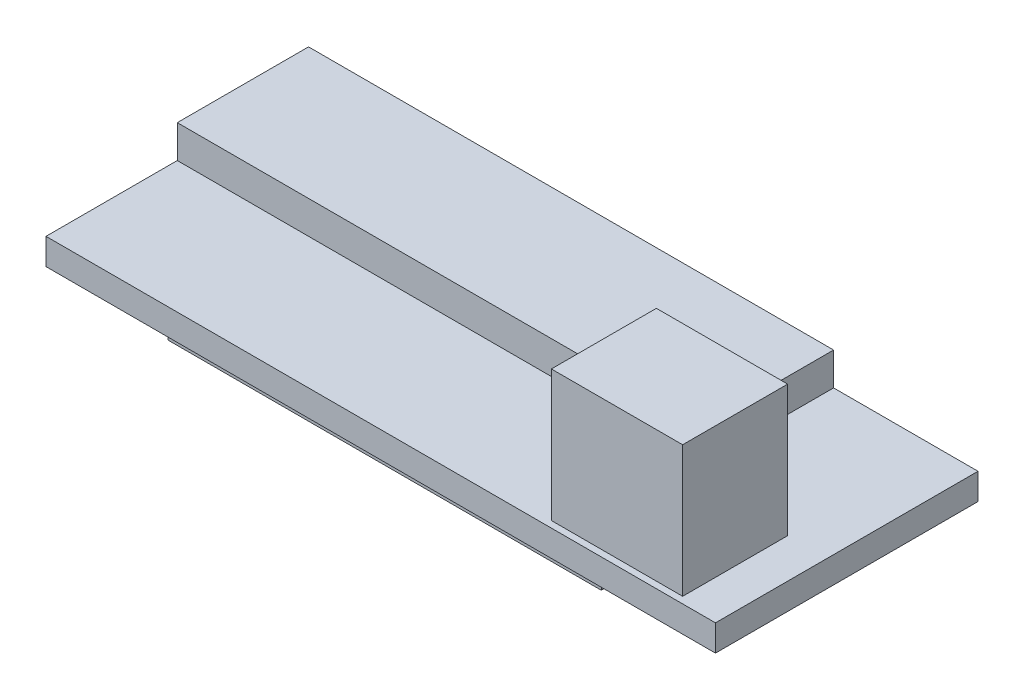
ISO-10303-21;
HEADER;
FILE_DESCRIPTION(('STEP AP214'),'2;1');
FILE_NAME('part.step','',(''),(''),'','','');
FILE_SCHEMA(('AUTOMOTIVE_DESIGN { 1 0 10303 214 1 1 1 1 }'));
ENDSEC;
DATA;
#1=APPLICATION_CONTEXT('core data for automotive mechanical design processes');
#2=APPLICATION_PROTOCOL_DEFINITION('international standard','automotive_design',2000,#1);
#3=PRODUCT_CONTEXT('',#1,'mechanical');
#4=PRODUCT('Part','Part','',(#3));
#5=PRODUCT_RELATED_PRODUCT_CATEGORY('part','',(#4));
#6=PRODUCT_DEFINITION_FORMATION('','',#4);
#7=PRODUCT_DEFINITION_CONTEXT('part definition',#1,'design');
#8=PRODUCT_DEFINITION('design','',#6,#7);
#9=PRODUCT_DEFINITION_SHAPE('','',#8);
#10=(LENGTH_UNIT() NAMED_UNIT(*) SI_UNIT(.MILLI.,.METRE.));
#11=(NAMED_UNIT(*) PLANE_ANGLE_UNIT() SI_UNIT($,.RADIAN.));
#12=(NAMED_UNIT(*) SI_UNIT($,.STERADIAN.) SOLID_ANGLE_UNIT());
#13=UNCERTAINTY_MEASURE_WITH_UNIT(LENGTH_MEASURE(1.E-05),#10,'distance_accuracy_value','');
#14=(GEOMETRIC_REPRESENTATION_CONTEXT(3) GLOBAL_UNCERTAINTY_ASSIGNED_CONTEXT((#13)) GLOBAL_UNIT_ASSIGNED_CONTEXT((#10,
#11,#12)) REPRESENTATION_CONTEXT('',''));
#15=CARTESIAN_POINT('',(0.,0.,0.));
#16=DIRECTION('',(0.,0.,1.));
#17=DIRECTION('',(1.,0.,0.));
#18=AXIS2_PLACEMENT_3D('',#15,#16,#17);
#19=CARTESIAN_POINT('',(0.,-8.5,0.));
#20=DIRECTION('',(0.,-1.,0.));
#21=DIRECTION('',(0.,0.,-1.));
#22=AXIS2_PLACEMENT_3D('',#19,#20,#21);
#23=PLANE('',#22);
#24=DIRECTION('',(0.,0.,1.));
#25=VECTOR('',#24,1.);
#26=CARTESIAN_POINT('',(8.5,-8.5,1.7));
#27=LINE('',#26,#25);
#28=CARTESIAN_POINT('',(8.5,-8.5,-3.4));
#29=VERTEX_POINT('',#28);
#30=CARTESIAN_POINT('',(8.5,-8.5,1.7));
#31=VERTEX_POINT('',#30);
#32=EDGE_CURVE('E196',#29,#31,#27,.T.);
#33=ORIENTED_EDGE('',*,*,#32,.T.);
#34=DIRECTION('',(-1.,0.,0.));
#35=VECTOR('',#34,1.);
#36=CARTESIAN_POINT('',(-24.5,-8.5,1.7));
#37=LINE('',#36,#35);
#38=CARTESIAN_POINT('',(-24.5,-8.5,1.7));
#39=VERTEX_POINT('',#38);
#40=EDGE_CURVE('E127',#31,#39,#37,.T.);
#41=ORIENTED_EDGE('',*,*,#40,.T.);
#42=DIRECTION('',(0.,0.,-1.));
#43=VECTOR('',#42,1.);
#44=CARTESIAN_POINT('',(-24.5,-8.5,1.7));
#45=LINE('',#44,#43);
#46=CARTESIAN_POINT('',(-24.5,-8.5,-3.4));
#47=VERTEX_POINT('',#46);
#48=EDGE_CURVE('E28',#39,#47,#45,.T.);
#49=ORIENTED_EDGE('',*,*,#48,.T.);
#50=DIRECTION('',(1.,0.,0.));
#51=VECTOR('',#50,1.);
#52=CARTESIAN_POINT('',(-24.5,-8.5,-3.4));
#53=LINE('',#52,#51);
#54=EDGE_CURVE('E11',#47,#29,#53,.T.);
#55=ORIENTED_EDGE('',*,*,#54,.T.);
#56=EDGE_LOOP('',(#33,#41,#49,#55));
#57=FACE_BOUND('',#56,.T.);
#58=ADVANCED_FACE('F17',(#57),#23,.T.);
#59=CARTESIAN_POINT('',(-24.5,-8.5,-3.4));
#60=DIRECTION('',(0.,0.,1.));
#61=DIRECTION('',(1.,0.,0.));
#62=AXIS2_PLACEMENT_3D('',#59,#60,#61);
#63=PLANE('',#62);
#64=DIRECTION('',(1.,0.,0.));
#65=VECTOR('',#64,1.);
#66=CARTESIAN_POINT('',(-24.5,0.,-3.4));
#67=LINE('',#66,#65);
#68=CARTESIAN_POINT('',(-24.5,0.,-3.4));
#69=VERTEX_POINT('',#68);
#70=CARTESIAN_POINT('',(8.5,0.,-3.4));
#71=VERTEX_POINT('',#70);
#72=EDGE_CURVE('E144',#69,#71,#67,.T.);
#73=ORIENTED_EDGE('',*,*,#72,.T.);
#74=DIRECTION('',(0.,1.,0.));
#75=VECTOR('',#74,1.);
#76=CARTESIAN_POINT('',(8.5,-8.5,-3.4));
#77=LINE('',#76,#75);
#78=EDGE_CURVE('E128',#29,#71,#77,.T.);
#79=ORIENTED_EDGE('',*,*,#78,.F.);
#80=ORIENTED_EDGE('',*,*,#54,.F.);
#81=DIRECTION('',(0.,1.,0.));
#82=VECTOR('',#81,1.);
#83=CARTESIAN_POINT('',(-24.5,-8.5,-3.4));
#84=LINE('',#83,#82);
#85=EDGE_CURVE('E271',#47,#69,#84,.T.);
#86=ORIENTED_EDGE('',*,*,#85,.T.);
#87=EDGE_LOOP('',(#73,#79,#80,#86));
#88=FACE_BOUND('',#87,.T.);
#89=ADVANCED_FACE('F352',(#88),#63,.F.);
#90=CARTESIAN_POINT('',(-24.5,-8.5,1.7));
#91=DIRECTION('',(1.,0.,0.));
#92=DIRECTION('',(0.,1.,0.));
#93=AXIS2_PLACEMENT_3D('',#90,#91,#92);
#94=PLANE('',#93);
#95=DIRECTION('',(0.,0.,-1.));
#96=VECTOR('',#95,1.);
#97=CARTESIAN_POINT('',(-24.5,0.,1.7));
#98=LINE('',#97,#96);
#99=CARTESIAN_POINT('',(-24.5,0.,1.7));
#100=VERTEX_POINT('',#99);
#101=EDGE_CURVE('E121',#100,#69,#98,.T.);
#102=ORIENTED_EDGE('',*,*,#101,.T.);
#103=ORIENTED_EDGE('',*,*,#85,.F.);
#104=ORIENTED_EDGE('',*,*,#48,.F.);
#105=DIRECTION('',(0.,1.,0.));
#106=VECTOR('',#105,1.);
#107=CARTESIAN_POINT('',(-24.5,-8.5,1.7));
#108=LINE('',#107,#106);
#109=EDGE_CURVE('E117',#39,#100,#108,.T.);
#110=ORIENTED_EDGE('',*,*,#109,.T.);
#111=EDGE_LOOP('',(#102,#103,#104,#110));
#112=FACE_BOUND('',#111,.T.);
#113=ADVANCED_FACE('F19',(#112),#94,.F.);
#114=CARTESIAN_POINT('',(-24.5,-8.5,1.7));
#115=DIRECTION('',(0.,0.,-1.));
#116=DIRECTION('',(0.,-1.,0.));
#117=AXIS2_PLACEMENT_3D('',#114,#115,#116);
#118=PLANE('',#117);
#119=DIRECTION('',(-1.,0.,0.));
#120=VECTOR('',#119,1.);
#121=CARTESIAN_POINT('',(-24.5,0.,1.7));
#122=LINE('',#121,#120);
#123=CARTESIAN_POINT('',(8.5,0.,1.7));
#124=VERTEX_POINT('',#123);
#125=EDGE_CURVE('E131',#124,#100,#122,.T.);
#126=ORIENTED_EDGE('',*,*,#125,.T.);
#127=ORIENTED_EDGE('',*,*,#109,.F.);
#128=ORIENTED_EDGE('',*,*,#40,.F.);
#129=DIRECTION('',(0.,1.,0.));
#130=VECTOR('',#129,1.);
#131=CARTESIAN_POINT('',(8.5,-8.5,1.7));
#132=LINE('',#131,#130);
#133=EDGE_CURVE('E134',#31,#124,#132,.T.);
#134=ORIENTED_EDGE('',*,*,#133,.T.);
#135=EDGE_LOOP('',(#126,#127,#128,#134));
#136=FACE_BOUND('',#135,.T.);
#137=ADVANCED_FACE('F132',(#136),#118,.F.);
#138=CARTESIAN_POINT('',(8.5,-8.5,1.7));
#139=DIRECTION('',(-1.,0.,0.));
#140=DIRECTION('',(0.,0.,1.));
#141=AXIS2_PLACEMENT_3D('',#138,#139,#140);
#142=PLANE('',#141);
#143=DIRECTION('',(0.,0.,1.));
#144=VECTOR('',#143,1.);
#145=CARTESIAN_POINT('',(8.5,0.,1.7));
#146=LINE('',#145,#144);
#147=EDGE_CURVE('E152',#71,#124,#146,.T.);
#148=ORIENTED_EDGE('',*,*,#147,.T.);
#149=ORIENTED_EDGE('',*,*,#133,.F.);
#150=ORIENTED_EDGE('',*,*,#32,.F.);
#151=ORIENTED_EDGE('',*,*,#78,.T.);
#152=EDGE_LOOP('',(#148,#149,#150,#151));
#153=FACE_BOUND('',#152,.T.);
#154=ADVANCED_FACE('F371',(#153),#142,.F.);
#155=CARTESIAN_POINT('',(0.,4.5,0.));
#156=DIRECTION('',(0.,1.,0.));
#157=DIRECTION('',(1.,0.,0.));
#158=AXIS2_PLACEMENT_3D('',#155,#156,#157);
#159=PLANE('',#158);
#160=DIRECTION('',(0.,0.,-1.));
#161=VECTOR('',#160,1.);
#162=CARTESIAN_POINT('',(14.5,4.5,-10.));
#163=LINE('',#162,#161);
#164=CARTESIAN_POINT('',(14.5,4.5,0.));
#165=VERTEX_POINT('',#164);
#166=CARTESIAN_POINT('',(14.5,4.5,-10.));
#167=VERTEX_POINT('',#166);
#168=EDGE_CURVE('E156',#165,#167,#163,.T.);
#169=ORIENTED_EDGE('',*,*,#168,.T.);
#170=DIRECTION('',(-1.,0.,0.));
#171=VECTOR('',#170,1.);
#172=CARTESIAN_POINT('',(-25.5,4.5,-10.));
#173=LINE('',#172,#171);
#174=CARTESIAN_POINT('',(-25.5,4.5,-10.));
#175=VERTEX_POINT('',#174);
#176=EDGE_CURVE('E158',#167,#175,#173,.T.);
#177=ORIENTED_EDGE('',*,*,#176,.T.);
#178=DIRECTION('',(0.,0.,1.));
#179=VECTOR('',#178,1.);
#180=CARTESIAN_POINT('',(-25.5,4.5,-10.));
#181=LINE('',#180,#179);
#182=CARTESIAN_POINT('',(-25.5,4.5,0.));
#183=VERTEX_POINT('',#182);
#184=EDGE_CURVE('E166',#175,#183,#181,.T.);
#185=ORIENTED_EDGE('',*,*,#184,.T.);
#186=DIRECTION('',(1.,0.,0.));
#187=VECTOR('',#186,1.);
#188=CARTESIAN_POINT('',(-25.5,4.5,0.));
#189=LINE('',#188,#187);
#190=EDGE_CURVE('E21',#183,#165,#189,.T.);
#191=ORIENTED_EDGE('',*,*,#190,.T.);
#192=EDGE_LOOP('',(#169,#177,#185,#191));
#193=FACE_BOUND('',#192,.T.);
#194=ADVANCED_FACE('F369',(#193),#159,.T.);
#195=CARTESIAN_POINT('',(-25.5,4.5,0.));
#196=DIRECTION('',(0.,0.,-1.));
#197=DIRECTION('',(0.,-1.,0.));
#198=AXIS2_PLACEMENT_3D('',#195,#196,#197);
#199=PLANE('',#198);
#200=DIRECTION('',(1.,0.,0.));
#201=VECTOR('',#200,1.);
#202=CARTESIAN_POINT('',(-25.5,2.,0.));
#203=LINE('',#202,#201);
#204=CARTESIAN_POINT('',(-25.5,2.,0.));
#205=VERTEX_POINT('',#204);
#206=CARTESIAN_POINT('',(14.5,2.,0.));
#207=VERTEX_POINT('',#206);
#208=EDGE_CURVE('E200',#205,#207,#203,.T.);
#209=ORIENTED_EDGE('',*,*,#208,.T.);
#210=DIRECTION('',(0.,-1.,0.));
#211=VECTOR('',#210,1.);
#212=CARTESIAN_POINT('',(14.5,4.5,0.));
#213=LINE('',#212,#211);
#214=EDGE_CURVE('E258',#165,#207,#213,.T.);
#215=ORIENTED_EDGE('',*,*,#214,.F.);
#216=ORIENTED_EDGE('',*,*,#190,.F.);
#217=DIRECTION('',(0.,-1.,0.));
#218=VECTOR('',#217,1.);
#219=CARTESIAN_POINT('',(-25.5,4.5,0.));
#220=LINE('',#219,#218);
#221=EDGE_CURVE('E163',#183,#205,#220,.T.);
#222=ORIENTED_EDGE('',*,*,#221,.T.);
#223=EDGE_LOOP('',(#209,#215,#216,#222));
#224=FACE_BOUND('',#223,.T.);
#225=ADVANCED_FACE('F360',(#224),#199,.F.);
#226=CARTESIAN_POINT('',(14.5,4.5,-10.));
#227=DIRECTION('',(-1.,0.,0.));
#228=DIRECTION('',(0.,1.,0.));
#229=AXIS2_PLACEMENT_3D('',#226,#227,#228);
#230=PLANE('',#229);
#231=DIRECTION('',(0.,0.,-1.));
#232=VECTOR('',#231,1.);
#233=CARTESIAN_POINT('',(14.5,2.,-10.));
#234=LINE('',#233,#232);
#235=CARTESIAN_POINT('',(14.5,2.,-10.));
#236=VERTEX_POINT('',#235);
#237=EDGE_CURVE('E192',#207,#236,#234,.T.);
#238=ORIENTED_EDGE('',*,*,#237,.T.);
#239=DIRECTION('',(0.,-1.,0.));
#240=VECTOR('',#239,1.);
#241=CARTESIAN_POINT('',(14.5,4.5,-10.));
#242=LINE('',#241,#240);
#243=EDGE_CURVE('E161',#167,#236,#242,.T.);
#244=ORIENTED_EDGE('',*,*,#243,.F.);
#245=ORIENTED_EDGE('',*,*,#168,.F.);
#246=ORIENTED_EDGE('',*,*,#214,.T.);
#247=EDGE_LOOP('',(#238,#244,#245,#246));
#248=FACE_BOUND('',#247,.T.);
#249=ADVANCED_FACE('F300',(#248),#230,.F.);
#250=CARTESIAN_POINT('',(0.,12.,0.));
#251=DIRECTION('',(0.,1.,0.));
#252=DIRECTION('',(1.,0.,0.));
#253=AXIS2_PLACEMENT_3D('',#250,#251,#252);
#254=PLANE('',#253);
#255=DIRECTION('',(0.,0.,-1.));
#256=VECTOR('',#255,1.);
#257=CARTESIAN_POINT('',(22.5,12.,1.5));
#258=LINE('',#257,#256);
#259=CARTESIAN_POINT('',(22.5,12.,9.5));
#260=VERTEX_POINT('',#259);
#261=CARTESIAN_POINT('',(22.5,12.,1.5));
#262=VERTEX_POINT('',#261);
#263=EDGE_CURVE('E189',#260,#262,#258,.T.);
#264=ORIENTED_EDGE('',*,*,#263,.T.);
#265=DIRECTION('',(-1.,0.,0.));
#266=VECTOR('',#265,1.);
#267=CARTESIAN_POINT('',(12.5,12.,1.5));
#268=LINE('',#267,#266);
#269=CARTESIAN_POINT('',(12.5,12.,1.5));
#270=VERTEX_POINT('',#269);
#271=EDGE_CURVE('E244',#262,#270,#268,.T.);
#272=ORIENTED_EDGE('',*,*,#271,.T.);
#273=DIRECTION('',(0.,0.,1.));
#274=VECTOR('',#273,1.);
#275=CARTESIAN_POINT('',(12.5,12.,1.5));
#276=LINE('',#275,#274);
#277=CARTESIAN_POINT('',(12.5,12.,9.5));
#278=VERTEX_POINT('',#277);
#279=EDGE_CURVE('E227',#270,#278,#276,.T.);
#280=ORIENTED_EDGE('',*,*,#279,.T.);
#281=DIRECTION('',(1.,0.,0.));
#282=VECTOR('',#281,1.);
#283=CARTESIAN_POINT('',(12.5,12.,9.5));
#284=LINE('',#283,#282);
#285=EDGE_CURVE('E230',#278,#260,#284,.T.);
#286=ORIENTED_EDGE('',*,*,#285,.T.);
#287=EDGE_LOOP('',(#264,#272,#280,#286));
#288=FACE_BOUND('',#287,.T.);
#289=ADVANCED_FACE('F341',(#288),#254,.T.);
#290=CARTESIAN_POINT('',(12.5,12.,9.5));
#291=DIRECTION('',(0.,0.,-1.));
#292=DIRECTION('',(0.,-1.,0.));
#293=AXIS2_PLACEMENT_3D('',#290,#291,#292);
#294=PLANE('',#293);
#295=DIRECTION('',(1.,0.,0.));
#296=VECTOR('',#295,1.);
#297=CARTESIAN_POINT('',(12.5,2.,9.5));
#298=LINE('',#297,#296);
#299=CARTESIAN_POINT('',(12.5,2.,9.5));
#300=VERTEX_POINT('',#299);
#301=CARTESIAN_POINT('',(22.5,2.,9.5));
#302=VERTEX_POINT('',#301);
#303=EDGE_CURVE('E173',#300,#302,#298,.T.);
#304=ORIENTED_EDGE('',*,*,#303,.T.);
#305=DIRECTION('',(0.,-1.,0.));
#306=VECTOR('',#305,1.);
#307=CARTESIAN_POINT('',(22.5,12.,9.5));
#308=LINE('',#307,#306);
#309=EDGE_CURVE('E207',#260,#302,#308,.T.);
#310=ORIENTED_EDGE('',*,*,#309,.F.);
#311=ORIENTED_EDGE('',*,*,#285,.F.);
#312=DIRECTION('',(0.,-1.,0.));
#313=VECTOR('',#312,1.);
#314=CARTESIAN_POINT('',(12.5,12.,9.5));
#315=LINE('',#314,#313);
#316=EDGE_CURVE('E231',#278,#300,#315,.T.);
#317=ORIENTED_EDGE('',*,*,#316,.T.);
#318=EDGE_LOOP('',(#304,#310,#311,#317));
#319=FACE_BOUND('',#318,.T.);
#320=ADVANCED_FACE('F339',(#319),#294,.F.);
#321=CARTESIAN_POINT('',(12.5,12.,1.5));
#322=DIRECTION('',(1.,0.,0.));
#323=DIRECTION('',(0.,0.,-1.));
#324=AXIS2_PLACEMENT_3D('',#321,#322,#323);
#325=PLANE('',#324);
#326=DIRECTION('',(0.,0.,1.));
#327=VECTOR('',#326,1.);
#328=CARTESIAN_POINT('',(12.5,2.,1.5));
#329=LINE('',#328,#327);
#330=CARTESIAN_POINT('',(12.5,2.,1.5));
#331=VERTEX_POINT('',#330);
#332=EDGE_CURVE('E168',#331,#300,#329,.T.);
#333=ORIENTED_EDGE('',*,*,#332,.T.);
#334=ORIENTED_EDGE('',*,*,#316,.F.);
#335=ORIENTED_EDGE('',*,*,#279,.F.);
#336=DIRECTION('',(0.,-1.,0.));
#337=VECTOR('',#336,1.);
#338=CARTESIAN_POINT('',(12.5,12.,1.5));
#339=LINE('',#338,#337);
#340=EDGE_CURVE('E252',#270,#331,#339,.T.);
#341=ORIENTED_EDGE('',*,*,#340,.T.);
#342=EDGE_LOOP('',(#333,#334,#335,#341));
#343=FACE_BOUND('',#342,.T.);
#344=ADVANCED_FACE('F326',(#343),#325,.F.);
#345=CARTESIAN_POINT('',(12.5,12.,1.5));
#346=DIRECTION('',(0.,0.,1.));
#347=DIRECTION('',(1.,0.,0.));
#348=AXIS2_PLACEMENT_3D('',#345,#346,#347);
#349=PLANE('',#348);
#350=DIRECTION('',(-1.,0.,0.));
#351=VECTOR('',#350,1.);
#352=CARTESIAN_POINT('',(12.5,2.,1.5));
#353=LINE('',#352,#351);
#354=CARTESIAN_POINT('',(22.5,2.,1.5));
#355=VERTEX_POINT('',#354);
#356=EDGE_CURVE('E184',#355,#331,#353,.T.);
#357=ORIENTED_EDGE('',*,*,#356,.T.);
#358=ORIENTED_EDGE('',*,*,#340,.F.);
#359=ORIENTED_EDGE('',*,*,#271,.F.);
#360=DIRECTION('',(0.,-1.,0.));
#361=VECTOR('',#360,1.);
#362=CARTESIAN_POINT('',(22.5,12.,1.5));
#363=LINE('',#362,#361);
#364=EDGE_CURVE('E185',#262,#355,#363,.T.);
#365=ORIENTED_EDGE('',*,*,#364,.T.);
#366=EDGE_LOOP('',(#357,#358,#359,#365));
#367=FACE_BOUND('',#366,.T.);
#368=ADVANCED_FACE('F332',(#367),#349,.F.);
#369=CARTESIAN_POINT('',(22.5,12.,1.5));
#370=DIRECTION('',(-1.,0.,0.));
#371=DIRECTION('',(0.,0.,1.));
#372=AXIS2_PLACEMENT_3D('',#369,#370,#371);
#373=PLANE('',#372);
#374=DIRECTION('',(0.,0.,-1.));
#375=VECTOR('',#374,1.);
#376=CARTESIAN_POINT('',(22.5,2.,1.5));
#377=LINE('',#376,#375);
#378=EDGE_CURVE('E180',#302,#355,#377,.T.);
#379=ORIENTED_EDGE('',*,*,#378,.T.);
#380=ORIENTED_EDGE('',*,*,#364,.F.);
#381=ORIENTED_EDGE('',*,*,#263,.F.);
#382=ORIENTED_EDGE('',*,*,#309,.T.);
#383=EDGE_LOOP('',(#379,#380,#381,#382));
#384=FACE_BOUND('',#383,.T.);
#385=ADVANCED_FACE('F337',(#384),#373,.F.);
#386=CARTESIAN_POINT('',(-25.5,2.,10.));
#387=DIRECTION('',(0.,0.,-1.));
#388=DIRECTION('',(0.,-1.,0.));
#389=AXIS2_PLACEMENT_3D('',#386,#387,#388);
#390=PLANE('',#389);
#391=DIRECTION('',(1.,0.,0.));
#392=VECTOR('',#391,1.);
#393=CARTESIAN_POINT('',(-25.5,0.,10.));
#394=LINE('',#393,#392);
#395=CARTESIAN_POINT('',(-25.5,0.,10.));
#396=VERTEX_POINT('',#395);
#397=CARTESIAN_POINT('',(25.5,0.,10.));
#398=VERTEX_POINT('',#397);
#399=EDGE_CURVE('E212',#396,#398,#394,.T.);
#400=ORIENTED_EDGE('',*,*,#399,.T.);
#401=DIRECTION('',(0.,-1.,0.));
#402=VECTOR('',#401,1.);
#403=CARTESIAN_POINT('',(25.5,2.,10.));
#404=LINE('',#403,#402);
#405=CARTESIAN_POINT('',(25.5,2.,10.));
#406=VERTEX_POINT('',#405);
#407=EDGE_CURVE('E224',#406,#398,#404,.T.);
#408=ORIENTED_EDGE('',*,*,#407,.F.);
#409=DIRECTION('',(1.,0.,0.));
#410=VECTOR('',#409,1.);
#411=CARTESIAN_POINT('',(-25.5,2.,10.));
#412=LINE('',#411,#410);
#413=CARTESIAN_POINT('',(-25.5,2.,10.));
#414=VERTEX_POINT('',#413);
#415=EDGE_CURVE('E174',#414,#406,#412,.T.);
#416=ORIENTED_EDGE('',*,*,#415,.F.);
#417=DIRECTION('',(0.,-1.,0.));
#418=VECTOR('',#417,1.);
#419=CARTESIAN_POINT('',(-25.5,2.,10.));
#420=LINE('',#419,#418);
#421=EDGE_CURVE('E167',#414,#396,#420,.T.);
#422=ORIENTED_EDGE('',*,*,#421,.T.);
#423=EDGE_LOOP('',(#400,#408,#416,#422));
#424=FACE_BOUND('',#423,.T.);
#425=ADVANCED_FACE('F365',(#424),#390,.F.);
#426=CARTESIAN_POINT('',(-25.5,2.,-10.));
#427=DIRECTION('',(1.,0.,0.));
#428=DIRECTION('',(0.,0.,-1.));
#429=AXIS2_PLACEMENT_3D('',#426,#427,#428);
#430=PLANE('',#429);
#431=DIRECTION('',(0.,0.,1.));
#432=VECTOR('',#431,1.);
#433=CARTESIAN_POINT('',(-25.5,0.,-10.));
#434=LINE('',#433,#432);
#435=CARTESIAN_POINT('',(-25.5,0.,-10.));
#436=VERTEX_POINT('',#435);
#437=EDGE_CURVE('E216',#436,#396,#434,.T.);
#438=ORIENTED_EDGE('',*,*,#437,.T.);
#439=ORIENTED_EDGE('',*,*,#421,.F.);
#440=DIRECTION('',(0.,0.,1.));
#441=VECTOR('',#440,1.);
#442=CARTESIAN_POINT('',(-25.5,2.,-10.));
#443=LINE('',#442,#441);
#444=EDGE_CURVE('E179',#205,#414,#443,.T.);
#445=ORIENTED_EDGE('',*,*,#444,.F.);
#446=ORIENTED_EDGE('',*,*,#221,.F.);
#447=ORIENTED_EDGE('',*,*,#184,.F.);
#448=DIRECTION('',(0.,-1.,0.));
#449=VECTOR('',#448,1.);
#450=CARTESIAN_POINT('',(-25.5,2.,-10.));
#451=LINE('',#450,#449);
#452=EDGE_CURVE('E162',#175,#436,#451,.T.);
#453=ORIENTED_EDGE('',*,*,#452,.T.);
#454=EDGE_LOOP('',(#438,#439,#445,#446,#447,#453));
#455=FACE_BOUND('',#454,.T.);
#456=ADVANCED_FACE('F526',(#455),#430,.F.);
#457=CARTESIAN_POINT('',(-25.5,2.,-10.));
#458=DIRECTION('',(0.,0.,1.));
#459=DIRECTION('',(1.,0.,0.));
#460=AXIS2_PLACEMENT_3D('',#457,#458,#459);
#461=PLANE('',#460);
#462=DIRECTION('',(-1.,0.,0.));
#463=VECTOR('',#462,1.);
#464=CARTESIAN_POINT('',(-25.5,0.,-10.));
#465=LINE('',#464,#463);
#466=CARTESIAN_POINT('',(25.5,0.,-10.));
#467=VERTEX_POINT('',#466);
#468=EDGE_CURVE('E220',#467,#436,#465,.T.);
#469=ORIENTED_EDGE('',*,*,#468,.T.);
#470=ORIENTED_EDGE('',*,*,#452,.F.);
#471=ORIENTED_EDGE('',*,*,#176,.F.);
#472=ORIENTED_EDGE('',*,*,#243,.T.);
#473=DIRECTION('',(-1.,0.,0.));
#474=VECTOR('',#473,1.);
#475=CARTESIAN_POINT('',(-25.5,2.,-10.));
#476=LINE('',#475,#474);
#477=CARTESIAN_POINT('',(25.5,2.,-10.));
#478=VERTEX_POINT('',#477);
#479=EDGE_CURVE('E139',#478,#236,#476,.T.);
#480=ORIENTED_EDGE('',*,*,#479,.F.);
#481=DIRECTION('',(0.,-1.,0.));
#482=VECTOR('',#481,1.);
#483=CARTESIAN_POINT('',(25.5,2.,-10.));
#484=LINE('',#483,#482);
#485=EDGE_CURVE('E172',#478,#467,#484,.T.);
#486=ORIENTED_EDGE('',*,*,#485,.T.);
#487=EDGE_LOOP('',(#469,#470,#471,#472,#480,#486));
#488=FACE_BOUND('',#487,.T.);
#489=ADVANCED_FACE('F293',(#488),#461,.F.);
#490=CARTESIAN_POINT('',(25.5,2.,-10.));
#491=DIRECTION('',(-1.,0.,0.));
#492=DIRECTION('',(0.,0.,1.));
#493=AXIS2_PLACEMENT_3D('',#490,#491,#492);
#494=PLANE('',#493);
#495=DIRECTION('',(0.,0.,-1.));
#496=VECTOR('',#495,1.);
#497=CARTESIAN_POINT('',(25.5,0.,-10.));
#498=LINE('',#497,#496);
#499=EDGE_CURVE('E208',#398,#467,#498,.T.);
#500=ORIENTED_EDGE('',*,*,#499,.T.);
#501=ORIENTED_EDGE('',*,*,#485,.F.);
#502=DIRECTION('',(0.,0.,-1.));
#503=VECTOR('',#502,1.);
#504=CARTESIAN_POINT('',(25.5,2.,-10.));
#505=LINE('',#504,#503);
#506=EDGE_CURVE('E178',#406,#478,#505,.T.);
#507=ORIENTED_EDGE('',*,*,#506,.F.);
#508=ORIENTED_EDGE('',*,*,#407,.T.);
#509=EDGE_LOOP('',(#500,#501,#507,#508));
#510=FACE_BOUND('',#509,.T.);
#511=ADVANCED_FACE('F368',(#510),#494,.F.);
#512=CARTESIAN_POINT('',(0.,2.,0.));
#513=DIRECTION('',(0.,1.,0.));
#514=DIRECTION('',(1.,0.,0.));
#515=AXIS2_PLACEMENT_3D('',#512,#513,#514);
#516=PLANE('',#515);
#517=ORIENTED_EDGE('',*,*,#356,.F.);
#518=ORIENTED_EDGE('',*,*,#378,.F.);
#519=ORIENTED_EDGE('',*,*,#303,.F.);
#520=ORIENTED_EDGE('',*,*,#332,.F.);
#521=EDGE_LOOP('',(#517,#518,#519,#520));
#522=FACE_BOUND('',#521,.T.);
#523=ORIENTED_EDGE('',*,*,#479,.T.);
#524=ORIENTED_EDGE('',*,*,#237,.F.);
#525=ORIENTED_EDGE('',*,*,#208,.F.);
#526=ORIENTED_EDGE('',*,*,#444,.T.);
#527=ORIENTED_EDGE('',*,*,#415,.T.);
#528=ORIENTED_EDGE('',*,*,#506,.T.);
#529=EDGE_LOOP('',(#523,#524,#525,#526,#527,#528));
#530=FACE_BOUND('',#529,.T.);
#531=ADVANCED_FACE('F306',(#522,#530),#516,.T.);
#532=CARTESIAN_POINT('',(0.,0.,0.));
#533=DIRECTION('',(0.,1.,0.));
#534=DIRECTION('',(1.,0.,0.));
#535=AXIS2_PLACEMENT_3D('',#532,#533,#534);
#536=PLANE('',#535);
#537=ORIENTED_EDGE('',*,*,#147,.F.);
#538=ORIENTED_EDGE('',*,*,#72,.F.);
#539=ORIENTED_EDGE('',*,*,#101,.F.);
#540=ORIENTED_EDGE('',*,*,#125,.F.);
#541=EDGE_LOOP('',(#537,#538,#539,#540));
#542=FACE_BOUND('',#541,.T.);
#543=ORIENTED_EDGE('',*,*,#499,.F.);
#544=ORIENTED_EDGE('',*,*,#399,.F.);
#545=ORIENTED_EDGE('',*,*,#437,.F.);
#546=ORIENTED_EDGE('',*,*,#468,.F.);
#547=EDGE_LOOP('',(#543,#544,#545,#546));
#548=FACE_BOUND('',#547,.T.);
#549=ADVANCED_FACE('F141',(#542,#548),#536,.F.);
#550=CLOSED_SHELL('',(#58,#89,#113,#137,#154,#194,#225,#249,#289,#320,#344,#368,#385,#425,#456,
#489,#511,#531,#549));
#551=MANIFOLD_SOLID_BREP('B1',#550);
#552=ADVANCED_BREP_SHAPE_REPRESENTATION('',(#18,#551),#14);
#553=SHAPE_DEFINITION_REPRESENTATION(#9,#552);
ENDSEC;
END-ISO-10303-21;
